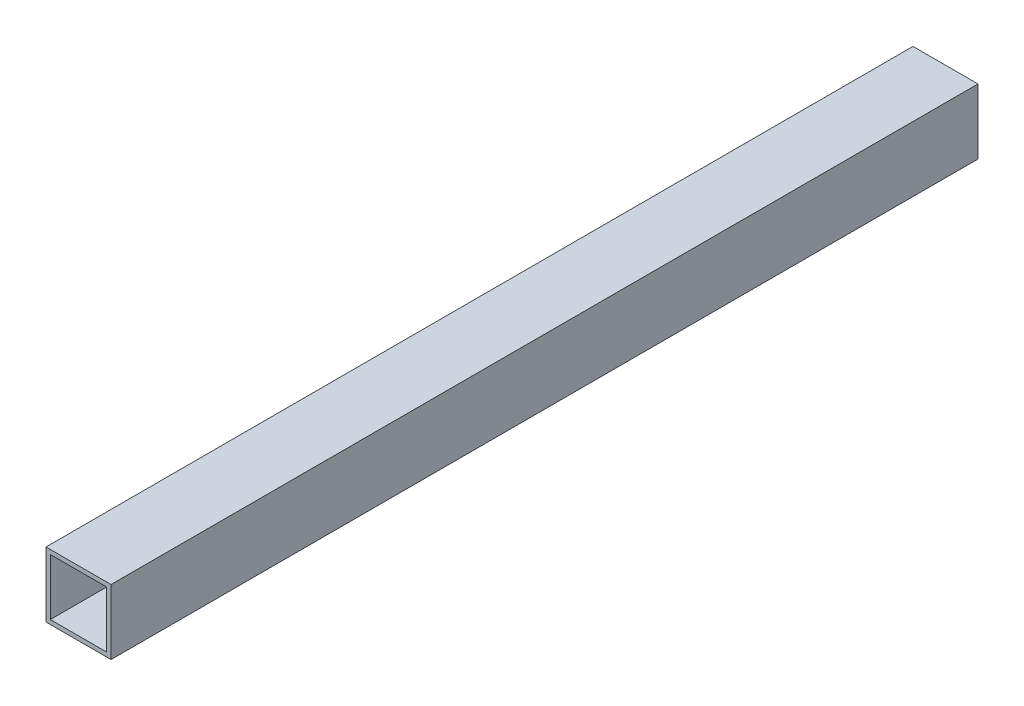
ISO-10303-21;
HEADER;
FILE_DESCRIPTION(('STEP AP214'),'2;1');
FILE_NAME('part.step','',(''),(''),'','','');
FILE_SCHEMA(('AUTOMOTIVE_DESIGN { 1 0 10303 214 1 1 1 1 }'));
ENDSEC;
DATA;
#1=APPLICATION_CONTEXT('core data for automotive mechanical design processes');
#2=APPLICATION_PROTOCOL_DEFINITION('international standard','automotive_design',2000,#1);
#3=PRODUCT_CONTEXT('',#1,'mechanical');
#4=PRODUCT('Part','Part','',(#3));
#5=PRODUCT_RELATED_PRODUCT_CATEGORY('part','',(#4));
#6=PRODUCT_DEFINITION_FORMATION('','',#4);
#7=PRODUCT_DEFINITION_CONTEXT('part definition',#1,'design');
#8=PRODUCT_DEFINITION('design','',#6,#7);
#9=PRODUCT_DEFINITION_SHAPE('','',#8);
#10=(LENGTH_UNIT() NAMED_UNIT(*) SI_UNIT(.MILLI.,.METRE.));
#11=(NAMED_UNIT(*) PLANE_ANGLE_UNIT() SI_UNIT($,.RADIAN.));
#12=(NAMED_UNIT(*) SI_UNIT($,.STERADIAN.) SOLID_ANGLE_UNIT());
#13=UNCERTAINTY_MEASURE_WITH_UNIT(LENGTH_MEASURE(1.E-05),#10,'distance_accuracy_value','');
#14=(GEOMETRIC_REPRESENTATION_CONTEXT(3) GLOBAL_UNCERTAINTY_ASSIGNED_CONTEXT((#13)) GLOBAL_UNIT_ASSIGNED_CONTEXT((#10,
#11,#12)) REPRESENTATION_CONTEXT('',''));
#15=CARTESIAN_POINT('',(0.,0.,0.));
#16=DIRECTION('',(0.,0.,1.));
#17=DIRECTION('',(1.,0.,0.));
#18=AXIS2_PLACEMENT_3D('',#15,#16,#17);
#19=CARTESIAN_POINT('',(0.,0.,200.));
#20=DIRECTION('',(0.,0.,1.));
#21=DIRECTION('',(1.,0.,0.));
#22=AXIS2_PLACEMENT_3D('',#19,#20,#21);
#23=PLANE('',#22);
#24=DIRECTION('',(0.,-1.,0.));
#25=VECTOR('',#24,1.);
#26=CARTESIAN_POINT('',(0.,0.,200.));
#27=LINE('',#26,#25);
#28=CARTESIAN_POINT('',(0.,0.,200.));
#29=VERTEX_POINT('',#28);
#30=CARTESIAN_POINT('',(0.,-15.,200.));
#31=VERTEX_POINT('',#30);
#32=EDGE_CURVE('E166',#29,#31,#27,.T.);
#33=ORIENTED_EDGE('',*,*,#32,.T.);
#34=DIRECTION('',(1.,0.,0.));
#35=VECTOR('',#34,1.);
#36=CARTESIAN_POINT('',(0.,-15.,200.));
#37=LINE('',#36,#35);
#38=CARTESIAN_POINT('',(15.,-15.,200.));
#39=VERTEX_POINT('',#38);
#40=EDGE_CURVE('E169',#31,#39,#37,.T.);
#41=ORIENTED_EDGE('',*,*,#40,.T.);
#42=DIRECTION('',(0.,1.,0.));
#43=VECTOR('',#42,1.);
#44=CARTESIAN_POINT('',(15.,0.,200.));
#45=LINE('',#44,#43);
#46=CARTESIAN_POINT('',(15.,0.,200.));
#47=VERTEX_POINT('',#46);
#48=EDGE_CURVE('E172',#39,#47,#45,.T.);
#49=ORIENTED_EDGE('',*,*,#48,.T.);
#50=DIRECTION('',(-1.,0.,0.));
#51=VECTOR('',#50,1.);
#52=CARTESIAN_POINT('',(0.,0.,200.));
#53=LINE('',#52,#51);
#54=EDGE_CURVE('E174',#47,#29,#53,.T.);
#55=ORIENTED_EDGE('',*,*,#54,.T.);
#56=EDGE_LOOP('',(#33,#41,#49,#55));
#57=FACE_BOUND('',#56,.T.);
#58=DIRECTION('',(1.,0.,0.));
#59=VECTOR('',#58,1.);
#60=CARTESIAN_POINT('',(0.,-14.,200.));
#61=LINE('',#60,#59);
#62=CARTESIAN_POINT('',(1.,-14.,200.));
#63=VERTEX_POINT('',#62);
#64=CARTESIAN_POINT('',(14.,-14.,200.));
#65=VERTEX_POINT('',#64);
#66=EDGE_CURVE('E138',#63,#65,#61,.T.);
#67=ORIENTED_EDGE('',*,*,#66,.F.);
#68=DIRECTION('',(0.,-1.,0.));
#69=VECTOR('',#68,1.);
#70=CARTESIAN_POINT('',(1.,0.,200.));
#71=LINE('',#70,#69);
#72=CARTESIAN_POINT('',(1.,-1.,200.));
#73=VERTEX_POINT('',#72);
#74=EDGE_CURVE('E130',#73,#63,#71,.T.);
#75=ORIENTED_EDGE('',*,*,#74,.F.);
#76=DIRECTION('',(-1.,0.,0.));
#77=VECTOR('',#76,1.);
#78=CARTESIAN_POINT('',(0.,-1.,200.));
#79=LINE('',#78,#77);
#80=CARTESIAN_POINT('',(14.,-1.,200.));
#81=VERTEX_POINT('',#80);
#82=EDGE_CURVE('E152',#81,#73,#79,.T.);
#83=ORIENTED_EDGE('',*,*,#82,.F.);
#84=DIRECTION('',(0.,1.,0.));
#85=VECTOR('',#84,1.);
#86=CARTESIAN_POINT('',(14.,0.,200.));
#87=LINE('',#86,#85);
#88=EDGE_CURVE('E150',#65,#81,#87,.T.);
#89=ORIENTED_EDGE('',*,*,#88,.F.);
#90=EDGE_LOOP('',(#67,#75,#83,#89));
#91=FACE_BOUND('',#90,.T.);
#92=ADVANCED_FACE('F65',(#57,#91),#23,.T.);
#93=CARTESIAN_POINT('',(0.,0.,0.));
#94=DIRECTION('',(0.,0.,1.));
#95=DIRECTION('',(1.,0.,0.));
#96=AXIS2_PLACEMENT_3D('',#93,#94,#95);
#97=PLANE('',#96);
#98=DIRECTION('',(0.,-1.,0.));
#99=VECTOR('',#98,1.);
#100=CARTESIAN_POINT('',(0.,0.,0.));
#101=LINE('',#100,#99);
#102=CARTESIAN_POINT('',(0.,0.,0.));
#103=VERTEX_POINT('',#102);
#104=CARTESIAN_POINT('',(0.,-15.,0.));
#105=VERTEX_POINT('',#104);
#106=EDGE_CURVE('E146',#103,#105,#101,.T.);
#107=ORIENTED_EDGE('',*,*,#106,.F.);
#108=DIRECTION('',(-1.,0.,0.));
#109=VECTOR('',#108,1.);
#110=CARTESIAN_POINT('',(0.,0.,0.));
#111=LINE('',#110,#109);
#112=CARTESIAN_POINT('',(15.,0.,0.));
#113=VERTEX_POINT('',#112);
#114=EDGE_CURVE('E170',#113,#103,#111,.T.);
#115=ORIENTED_EDGE('',*,*,#114,.F.);
#116=DIRECTION('',(0.,1.,0.));
#117=VECTOR('',#116,1.);
#118=CARTESIAN_POINT('',(15.,0.,0.));
#119=LINE('',#118,#117);
#120=CARTESIAN_POINT('',(15.,-15.,0.));
#121=VERTEX_POINT('',#120);
#122=EDGE_CURVE('E181',#121,#113,#119,.T.);
#123=ORIENTED_EDGE('',*,*,#122,.F.);
#124=DIRECTION('',(1.,0.,0.));
#125=VECTOR('',#124,1.);
#126=CARTESIAN_POINT('',(0.,-15.,0.));
#127=LINE('',#126,#125);
#128=EDGE_CURVE('E179',#105,#121,#127,.T.);
#129=ORIENTED_EDGE('',*,*,#128,.F.);
#130=EDGE_LOOP('',(#107,#115,#123,#129));
#131=FACE_BOUND('',#130,.T.);
#132=DIRECTION('',(0.,-1.,0.));
#133=VECTOR('',#132,1.);
#134=CARTESIAN_POINT('',(1.,0.,0.));
#135=LINE('',#134,#133);
#136=CARTESIAN_POINT('',(1.,-1.,0.));
#137=VERTEX_POINT('',#136);
#138=CARTESIAN_POINT('',(1.,-14.,0.));
#139=VERTEX_POINT('',#138);
#140=EDGE_CURVE('E88',#137,#139,#135,.T.);
#141=ORIENTED_EDGE('',*,*,#140,.T.);
#142=DIRECTION('',(1.,0.,0.));
#143=VECTOR('',#142,1.);
#144=CARTESIAN_POINT('',(0.,-14.,0.));
#145=LINE('',#144,#143);
#146=CARTESIAN_POINT('',(14.,-14.,0.));
#147=VERTEX_POINT('',#146);
#148=EDGE_CURVE('E145',#139,#147,#145,.T.);
#149=ORIENTED_EDGE('',*,*,#148,.T.);
#150=DIRECTION('',(0.,1.,0.));
#151=VECTOR('',#150,1.);
#152=CARTESIAN_POINT('',(14.,0.,0.));
#153=LINE('',#152,#151);
#154=CARTESIAN_POINT('',(14.,-1.,0.));
#155=VERTEX_POINT('',#154);
#156=EDGE_CURVE('E158',#147,#155,#153,.T.);
#157=ORIENTED_EDGE('',*,*,#156,.T.);
#158=DIRECTION('',(-1.,0.,0.));
#159=VECTOR('',#158,1.);
#160=CARTESIAN_POINT('',(0.,-1.,0.));
#161=LINE('',#160,#159);
#162=EDGE_CURVE('E139',#155,#137,#161,.T.);
#163=ORIENTED_EDGE('',*,*,#162,.T.);
#164=EDGE_LOOP('',(#141,#149,#157,#163));
#165=FACE_BOUND('',#164,.T.);
#166=ADVANCED_FACE('F199',(#131,#165),#97,.F.);
#167=CARTESIAN_POINT('',(0.,0.,200.));
#168=DIRECTION('',(1.,0.,0.));
#169=DIRECTION('',(0.,0.,-1.));
#170=AXIS2_PLACEMENT_3D('',#167,#168,#169);
#171=PLANE('',#170);
#172=ORIENTED_EDGE('',*,*,#106,.T.);
#173=DIRECTION('',(0.,0.,-1.));
#174=VECTOR('',#173,1.);
#175=CARTESIAN_POINT('',(0.,-15.,200.));
#176=LINE('',#175,#174);
#177=EDGE_CURVE('E12',#31,#105,#176,.T.);
#178=ORIENTED_EDGE('',*,*,#177,.F.);
#179=ORIENTED_EDGE('',*,*,#32,.F.);
#180=DIRECTION('',(0.,0.,-1.));
#181=VECTOR('',#180,1.);
#182=CARTESIAN_POINT('',(0.,0.,200.));
#183=LINE('',#182,#181);
#184=EDGE_CURVE('E176',#29,#103,#183,.T.);
#185=ORIENTED_EDGE('',*,*,#184,.T.);
#186=EDGE_LOOP('',(#172,#178,#179,#185));
#187=FACE_BOUND('',#186,.T.);
#188=ADVANCED_FACE('F67',(#187),#171,.F.);
#189=CARTESIAN_POINT('',(0.,-15.,200.));
#190=DIRECTION('',(0.,1.,0.));
#191=DIRECTION('',(0.,0.,1.));
#192=AXIS2_PLACEMENT_3D('',#189,#190,#191);
#193=PLANE('',#192);
#194=ORIENTED_EDGE('',*,*,#128,.T.);
#195=DIRECTION('',(0.,0.,-1.));
#196=VECTOR('',#195,1.);
#197=CARTESIAN_POINT('',(15.,-15.,200.));
#198=LINE('',#197,#196);
#199=EDGE_CURVE('E73',#39,#121,#198,.T.);
#200=ORIENTED_EDGE('',*,*,#199,.F.);
#201=ORIENTED_EDGE('',*,*,#40,.F.);
#202=ORIENTED_EDGE('',*,*,#177,.T.);
#203=EDGE_LOOP('',(#194,#200,#201,#202));
#204=FACE_BOUND('',#203,.T.);
#205=ADVANCED_FACE('F209',(#204),#193,.F.);
#206=CARTESIAN_POINT('',(15.,0.,200.));
#207=DIRECTION('',(-1.,0.,0.));
#208=DIRECTION('',(0.,-1.,0.));
#209=AXIS2_PLACEMENT_3D('',#206,#207,#208);
#210=PLANE('',#209);
#211=ORIENTED_EDGE('',*,*,#122,.T.);
#212=DIRECTION('',(0.,0.,-1.));
#213=VECTOR('',#212,1.);
#214=CARTESIAN_POINT('',(15.,0.,200.));
#215=LINE('',#214,#213);
#216=EDGE_CURVE('E186',#47,#113,#215,.T.);
#217=ORIENTED_EDGE('',*,*,#216,.F.);
#218=ORIENTED_EDGE('',*,*,#48,.F.);
#219=ORIENTED_EDGE('',*,*,#199,.T.);
#220=EDGE_LOOP('',(#211,#217,#218,#219));
#221=FACE_BOUND('',#220,.T.);
#222=ADVANCED_FACE('F193',(#221),#210,.F.);
#223=CARTESIAN_POINT('',(0.,0.,200.));
#224=DIRECTION('',(0.,-1.,0.));
#225=DIRECTION('',(0.,0.,-1.));
#226=AXIS2_PLACEMENT_3D('',#223,#224,#225);
#227=PLANE('',#226);
#228=ORIENTED_EDGE('',*,*,#114,.T.);
#229=ORIENTED_EDGE('',*,*,#184,.F.);
#230=ORIENTED_EDGE('',*,*,#54,.F.);
#231=ORIENTED_EDGE('',*,*,#216,.T.);
#232=EDGE_LOOP('',(#228,#229,#230,#231));
#233=FACE_BOUND('',#232,.T.);
#234=ADVANCED_FACE('F203',(#233),#227,.F.);
#235=CARTESIAN_POINT('',(1.,0.,200.));
#236=DIRECTION('',(1.,0.,0.));
#237=DIRECTION('',(0.,0.,-1.));
#238=AXIS2_PLACEMENT_3D('',#235,#236,#237);
#239=PLANE('',#238);
#240=ORIENTED_EDGE('',*,*,#140,.F.);
#241=DIRECTION('',(0.,0.,-1.));
#242=VECTOR('',#241,1.);
#243=CARTESIAN_POINT('',(1.,-1.,200.));
#244=LINE('',#243,#242);
#245=EDGE_CURVE('E134',#73,#137,#244,.T.);
#246=ORIENTED_EDGE('',*,*,#245,.F.);
#247=ORIENTED_EDGE('',*,*,#74,.T.);
#248=DIRECTION('',(0.,0.,-1.));
#249=VECTOR('',#248,1.);
#250=CARTESIAN_POINT('',(1.,-14.,200.));
#251=LINE('',#250,#249);
#252=EDGE_CURVE('E133',#63,#139,#251,.T.);
#253=ORIENTED_EDGE('',*,*,#252,.T.);
#254=EDGE_LOOP('',(#240,#246,#247,#253));
#255=FACE_BOUND('',#254,.T.);
#256=ADVANCED_FACE('F132',(#255),#239,.T.);
#257=CARTESIAN_POINT('',(0.,-14.,200.));
#258=DIRECTION('',(0.,1.,0.));
#259=DIRECTION('',(0.,0.,1.));
#260=AXIS2_PLACEMENT_3D('',#257,#258,#259);
#261=PLANE('',#260);
#262=ORIENTED_EDGE('',*,*,#148,.F.);
#263=ORIENTED_EDGE('',*,*,#252,.F.);
#264=ORIENTED_EDGE('',*,*,#66,.T.);
#265=DIRECTION('',(0.,0.,-1.));
#266=VECTOR('',#265,1.);
#267=CARTESIAN_POINT('',(14.,-14.,200.));
#268=LINE('',#267,#266);
#269=EDGE_CURVE('E147',#65,#147,#268,.T.);
#270=ORIENTED_EDGE('',*,*,#269,.T.);
#271=EDGE_LOOP('',(#262,#263,#264,#270));
#272=FACE_BOUND('',#271,.T.);
#273=ADVANCED_FACE('F142',(#272),#261,.T.);
#274=CARTESIAN_POINT('',(14.,0.,200.));
#275=DIRECTION('',(-1.,0.,0.));
#276=DIRECTION('',(0.,-1.,0.));
#277=AXIS2_PLACEMENT_3D('',#274,#275,#276);
#278=PLANE('',#277);
#279=ORIENTED_EDGE('',*,*,#156,.F.);
#280=ORIENTED_EDGE('',*,*,#269,.F.);
#281=ORIENTED_EDGE('',*,*,#88,.T.);
#282=DIRECTION('',(0.,0.,-1.));
#283=VECTOR('',#282,1.);
#284=CARTESIAN_POINT('',(14.,-1.,200.));
#285=LINE('',#284,#283);
#286=EDGE_CURVE('E80',#81,#155,#285,.T.);
#287=ORIENTED_EDGE('',*,*,#286,.T.);
#288=EDGE_LOOP('',(#279,#280,#281,#287));
#289=FACE_BOUND('',#288,.T.);
#290=ADVANCED_FACE('F232',(#289),#278,.T.);
#291=CARTESIAN_POINT('',(0.,-1.,200.));
#292=DIRECTION('',(0.,-1.,0.));
#293=DIRECTION('',(0.,0.,-1.));
#294=AXIS2_PLACEMENT_3D('',#291,#292,#293);
#295=PLANE('',#294);
#296=ORIENTED_EDGE('',*,*,#162,.F.);
#297=ORIENTED_EDGE('',*,*,#286,.F.);
#298=ORIENTED_EDGE('',*,*,#82,.T.);
#299=ORIENTED_EDGE('',*,*,#245,.T.);
#300=EDGE_LOOP('',(#296,#297,#298,#299));
#301=FACE_BOUND('',#300,.T.);
#302=ADVANCED_FACE('F236',(#301),#295,.T.);
#303=CLOSED_SHELL('',(#92,#166,#188,#205,#222,#234,#256,#273,#290,#302));
#304=MANIFOLD_SOLID_BREP('B2',#303);
#305=ADVANCED_BREP_SHAPE_REPRESENTATION('',(#18,#304),#14);
#306=SHAPE_DEFINITION_REPRESENTATION(#9,#305);
ENDSEC;
END-ISO-10303-21;
